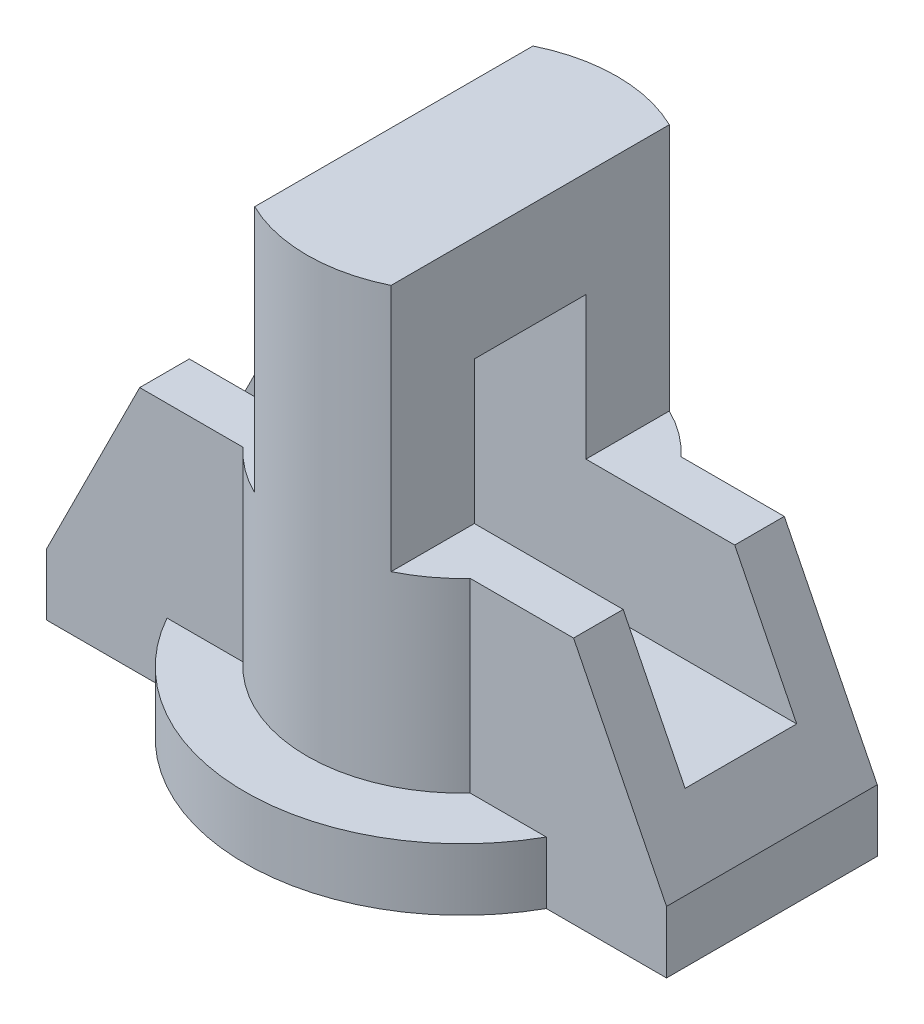
ISO-10303-21;
HEADER;
FILE_DESCRIPTION(('STEP AP214'),'2;1');
FILE_NAME('part.step','',(''),(''),'','','');
FILE_SCHEMA(('AUTOMOTIVE_DESIGN { 1 0 10303 214 1 1 1 1 }'));
ENDSEC;
DATA;
#1=APPLICATION_CONTEXT('core data for automotive mechanical design processes');
#2=APPLICATION_PROTOCOL_DEFINITION('international standard','automotive_design',2000,#1);
#3=PRODUCT_CONTEXT('',#1,'mechanical');
#4=PRODUCT('Part','Part','',(#3));
#5=PRODUCT_RELATED_PRODUCT_CATEGORY('part','',(#4));
#6=PRODUCT_DEFINITION_FORMATION('','',#4);
#7=PRODUCT_DEFINITION_CONTEXT('part definition',#1,'design');
#8=PRODUCT_DEFINITION('design','',#6,#7);
#9=PRODUCT_DEFINITION_SHAPE('','',#8);
#10=(LENGTH_UNIT() NAMED_UNIT(*) SI_UNIT(.MILLI.,.METRE.));
#11=(NAMED_UNIT(*) PLANE_ANGLE_UNIT() SI_UNIT($,.RADIAN.));
#12=(NAMED_UNIT(*) SI_UNIT($,.STERADIAN.) SOLID_ANGLE_UNIT());
#13=UNCERTAINTY_MEASURE_WITH_UNIT(LENGTH_MEASURE(1.E-05),#10,'distance_accuracy_value','');
#14=(GEOMETRIC_REPRESENTATION_CONTEXT(3) GLOBAL_UNCERTAINTY_ASSIGNED_CONTEXT((#13)) GLOBAL_UNIT_ASSIGNED_CONTEXT((#10,
#11,#12)) REPRESENTATION_CONTEXT('',''));
#15=CARTESIAN_POINT('',(0.,0.,0.));
#16=DIRECTION('',(0.,0.,1.));
#17=DIRECTION('',(1.,0.,0.));
#18=AXIS2_PLACEMENT_3D('',#15,#16,#17);
#19=CARTESIAN_POINT('',(0.,40.,0.));
#20=DIRECTION('',(0.,1.,0.));
#21=DIRECTION('',(0.,0.,1.));
#22=AXIS2_PLACEMENT_3D('',#19,#20,#21);
#23=PLANE('',#22);
#24=DIRECTION('',(-1.,0.,0.));
#25=VECTOR('',#24,1.);
#26=CARTESIAN_POINT('',(0.,40.,-9.00000000000001));
#27=LINE('',#26,#25);
#28=CARTESIAN_POINT('',(-11.,40.,-9.00000000000001));
#29=VERTEX_POINT('',#28);
#30=CARTESIAN_POINT('',(-34.9999999999993,40.,-9.00000000000001));
#31=VERTEX_POINT('',#30);
#32=EDGE_CURVE('E460',#29,#31,#27,.T.);
#33=ORIENTED_EDGE('',*,*,#32,.F.);
#34=DIRECTION('',(0.,0.,1.));
#35=VECTOR('',#34,1.);
#36=CARTESIAN_POINT('',(-11.,40.,0.));
#37=LINE('',#36,#35);
#38=CARTESIAN_POINT('',(-11.,40.,-22.4499443206437));
#39=VERTEX_POINT('',#38);
#40=EDGE_CURVE('E321',#39,#29,#37,.T.);
#41=ORIENTED_EDGE('',*,*,#40,.F.);
#42=CARTESIAN_POINT('',(0.,40.,0.));
#43=DIRECTION('',(0.,1.,0.));
#44=DIRECTION('',(0.,0.,1.));
#45=AXIS2_PLACEMENT_3D('',#42,#43,#44);
#46=CIRCLE('',#45,25.);
#47=CARTESIAN_POINT('',(-18.3303027798234,40.,-17.));
#48=VERTEX_POINT('',#47);
#49=EDGE_CURVE('E325',#39,#48,#46,.T.);
#50=ORIENTED_EDGE('',*,*,#49,.T.);
#51=DIRECTION('',(1.,0.,0.));
#52=VECTOR('',#51,1.);
#53=CARTESIAN_POINT('',(0.,40.,-17.));
#54=LINE('',#53,#52);
#55=CARTESIAN_POINT('',(-34.9999999999993,40.,-17.));
#56=VERTEX_POINT('',#55);
#57=EDGE_CURVE('E329',#56,#48,#54,.T.);
#58=ORIENTED_EDGE('',*,*,#57,.F.);
#59=DIRECTION('',(0.,0.,-1.));
#60=VECTOR('',#59,1.);
#61=CARTESIAN_POINT('',(-34.9999999999993,40.,0.));
#62=LINE('',#61,#60);
#63=EDGE_CURVE('E440',#31,#56,#62,.T.);
#64=ORIENTED_EDGE('',*,*,#63,.F.);
#65=EDGE_LOOP('',(#33,#41,#50,#58,#64));
#66=FACE_BOUND('',#65,.T.);
#67=ADVANCED_FACE('F45',(#66),#23,.T.);
#68=CARTESIAN_POINT('',(0.,40.,0.));
#69=DIRECTION('',(0.,1.,0.));
#70=DIRECTION('',(0.,0.,1.));
#71=AXIS2_PLACEMENT_3D('',#68,#69,#70);
#72=PLANE('',#71);
#73=DIRECTION('',(-1.,0.,0.));
#74=VECTOR('',#73,1.);
#75=CARTESIAN_POINT('',(0.,40.,-9.00000000000001));
#76=LINE('',#75,#74);
#77=CARTESIAN_POINT('',(35.0000000000007,40.,-9.00000000000001));
#78=VERTEX_POINT('',#77);
#79=CARTESIAN_POINT('',(11.,40.,-9.00000000000001));
#80=VERTEX_POINT('',#79);
#81=EDGE_CURVE('E246',#78,#80,#76,.T.);
#82=ORIENTED_EDGE('',*,*,#81,.F.);
#83=DIRECTION('',(0.,0.,1.));
#84=VECTOR('',#83,1.);
#85=CARTESIAN_POINT('',(35.0000000000007,40.,0.));
#86=LINE('',#85,#84);
#87=CARTESIAN_POINT('',(35.0000000000007,40.,-16.9999999999994));
#88=VERTEX_POINT('',#87);
#89=EDGE_CURVE('E437',#88,#78,#86,.T.);
#90=ORIENTED_EDGE('',*,*,#89,.F.);
#91=DIRECTION('',(1.,0.,0.));
#92=VECTOR('',#91,1.);
#93=CARTESIAN_POINT('',(-6.94156270925405E-13,40.,-16.999999999998));
#94=LINE('',#93,#92);
#95=CARTESIAN_POINT('',(18.3303027798246,40.,-16.9999999999987));
#96=VERTEX_POINT('',#95);
#97=EDGE_CURVE('E273',#96,#88,#94,.T.);
#98=ORIENTED_EDGE('',*,*,#97,.F.);
#99=CARTESIAN_POINT('',(0.,40.,0.));
#100=DIRECTION('',(0.,1.,0.));
#101=DIRECTION('',(0.,0.,1.));
#102=AXIS2_PLACEMENT_3D('',#99,#100,#101);
#103=CIRCLE('',#102,25.);
#104=CARTESIAN_POINT('',(11.,40.,-22.4499443206437));
#105=VERTEX_POINT('',#104);
#106=EDGE_CURVE('E278',#96,#105,#103,.T.);
#107=ORIENTED_EDGE('',*,*,#106,.T.);
#108=DIRECTION('',(0.,0.,1.));
#109=VECTOR('',#108,1.);
#110=CARTESIAN_POINT('',(11.,40.,0.));
#111=LINE('',#110,#109);
#112=EDGE_CURVE('E283',#105,#80,#111,.T.);
#113=ORIENTED_EDGE('',*,*,#112,.T.);
#114=EDGE_LOOP('',(#82,#90,#98,#107,#113));
#115=FACE_BOUND('',#114,.T.);
#116=ADVANCED_FACE('F503',(#115),#72,.T.);
#117=CARTESIAN_POINT('',(11.,80.,0.));
#118=DIRECTION('',(1.,0.,0.));
#119=DIRECTION('',(0.,0.,-1.));
#120=AXIS2_PLACEMENT_3D('',#117,#118,#119);
#121=PLANE('',#120);
#122=DIRECTION('',(0.,1.,0.));
#123=VECTOR('',#122,1.);
#124=CARTESIAN_POINT('',(11.,80.,-9.00000000000001));
#125=LINE('',#124,#123);
#126=CARTESIAN_POINT('',(11.,63.,-9.00000000000001));
#127=VERTEX_POINT('',#126);
#128=EDGE_CURVE('E240',#80,#127,#125,.T.);
#129=ORIENTED_EDGE('',*,*,#128,.F.);
#130=ORIENTED_EDGE('',*,*,#112,.F.);
#131=DIRECTION('',(0.,-1.,0.));
#132=VECTOR('',#131,1.);
#133=CARTESIAN_POINT('',(11.,80.,-22.4499443206437));
#134=LINE('',#133,#132);
#135=CARTESIAN_POINT('',(11.,80.,-22.4499443206437));
#136=VERTEX_POINT('',#135);
#137=EDGE_CURVE('E432',#136,#105,#134,.T.);
#138=ORIENTED_EDGE('',*,*,#137,.F.);
#139=DIRECTION('',(0.,0.,1.));
#140=VECTOR('',#139,1.);
#141=CARTESIAN_POINT('',(11.,80.,0.));
#142=LINE('',#141,#140);
#143=CARTESIAN_POINT('',(11.,80.,22.4499443206437));
#144=VERTEX_POINT('',#143);
#145=EDGE_CURVE('E408',#136,#144,#142,.T.);
#146=ORIENTED_EDGE('',*,*,#145,.T.);
#147=DIRECTION('',(0.,-1.,0.));
#148=VECTOR('',#147,1.);
#149=CARTESIAN_POINT('',(11.,80.,22.4499443206437));
#150=LINE('',#149,#148);
#151=CARTESIAN_POINT('',(11.,40.,22.4499443206437));
#152=VERTEX_POINT('',#151);
#153=EDGE_CURVE('E421',#144,#152,#150,.T.);
#154=ORIENTED_EDGE('',*,*,#153,.T.);
#155=CARTESIAN_POINT('',(11.,40.,9.));
#156=VERTEX_POINT('',#155);
#157=EDGE_CURVE('E282',#156,#152,#111,.T.);
#158=ORIENTED_EDGE('',*,*,#157,.F.);
#159=DIRECTION('',(0.,-1.,0.));
#160=VECTOR('',#159,1.);
#161=CARTESIAN_POINT('',(11.,80.,8.99999999999999));
#162=LINE('',#161,#160);
#163=CARTESIAN_POINT('',(11.,63.,8.99999999999999));
#164=VERTEX_POINT('',#163);
#165=EDGE_CURVE('E514',#164,#156,#162,.T.);
#166=ORIENTED_EDGE('',*,*,#165,.F.);
#167=DIRECTION('',(0.,0.,1.));
#168=VECTOR('',#167,1.);
#169=CARTESIAN_POINT('',(11.,63.,0.));
#170=LINE('',#169,#168);
#171=EDGE_CURVE('E239',#127,#164,#170,.T.);
#172=ORIENTED_EDGE('',*,*,#171,.F.);
#173=EDGE_LOOP('',(#129,#130,#138,#146,#154,#158,#166,#172));
#174=FACE_BOUND('',#173,.T.);
#175=ADVANCED_FACE('F47',(#174),#121,.T.);
#176=CARTESIAN_POINT('',(0.,80.,0.));
#177=DIRECTION('',(0.,-1.,0.));
#178=DIRECTION('',(0.,0.,-1.));
#179=AXIS2_PLACEMENT_3D('',#176,#177,#178);
#180=CYLINDRICAL_SURFACE('',#179,25.);
#181=ORIENTED_EDGE('',*,*,#137,.T.);
#182=ORIENTED_EDGE('',*,*,#106,.F.);
#183=DIRECTION('',(0.,-1.,0.));
#184=VECTOR('',#183,1.);
#185=CARTESIAN_POINT('',(18.3303027798246,40.,-16.9999999999987));
#186=LINE('',#185,#184);
#187=CARTESIAN_POINT('',(18.3303027798246,10.,-16.9999999999987));
#188=VERTEX_POINT('',#187);
#189=EDGE_CURVE('E304',#96,#188,#186,.T.);
#190=ORIENTED_EDGE('',*,*,#189,.T.);
#191=CARTESIAN_POINT('',(0.,10.,0.));
#192=DIRECTION('',(0.,1.,0.));
#193=DIRECTION('',(0.,0.,1.));
#194=AXIS2_PLACEMENT_3D('',#191,#192,#193);
#195=CIRCLE('',#194,25.);
#196=CARTESIAN_POINT('',(-18.3303027798234,10.,-17.));
#197=VERTEX_POINT('',#196);
#198=EDGE_CURVE('E395',#188,#197,#195,.T.);
#199=ORIENTED_EDGE('',*,*,#198,.T.);
#200=DIRECTION('',(0.,-1.,0.));
#201=VECTOR('',#200,1.);
#202=CARTESIAN_POINT('',(-18.3303027798234,40.,-17.));
#203=LINE('',#202,#201);
#204=EDGE_CURVE('E355',#48,#197,#203,.T.);
#205=ORIENTED_EDGE('',*,*,#204,.F.);
#206=ORIENTED_EDGE('',*,*,#49,.F.);
#207=DIRECTION('',(0.,-1.,0.));
#208=VECTOR('',#207,1.);
#209=CARTESIAN_POINT('',(-11.,80.,-22.4499443206437));
#210=LINE('',#209,#208);
#211=CARTESIAN_POINT('',(-11.,80.,-22.4499443206437));
#212=VERTEX_POINT('',#211);
#213=EDGE_CURVE('E429',#212,#39,#210,.T.);
#214=ORIENTED_EDGE('',*,*,#213,.F.);
#215=CARTESIAN_POINT('',(0.,80.,0.));
#216=DIRECTION('',(0.,1.,0.));
#217=DIRECTION('',(0.,0.,1.));
#218=AXIS2_PLACEMENT_3D('',#215,#216,#217);
#219=CIRCLE('',#218,25.);
#220=EDGE_CURVE('E412',#136,#212,#219,.T.);
#221=ORIENTED_EDGE('',*,*,#220,.F.);
#222=EDGE_LOOP('',(#181,#182,#190,#199,#205,#206,#214,#221));
#223=FACE_BOUND('',#222,.T.);
#224=ADVANCED_FACE('F614',(#223),#180,.T.);
#225=CARTESIAN_POINT('',(-11.,80.,0.));
#226=DIRECTION('',(1.,0.,0.));
#227=DIRECTION('',(0.,0.,-1.));
#228=AXIS2_PLACEMENT_3D('',#225,#226,#227);
#229=PLANE('',#228);
#230=ORIENTED_EDGE('',*,*,#40,.T.);
#231=DIRECTION('',(0.,1.,0.));
#232=VECTOR('',#231,1.);
#233=CARTESIAN_POINT('',(-11.,80.,-9.00000000000001));
#234=LINE('',#233,#232);
#235=CARTESIAN_POINT('',(-11.,63.,-9.00000000000001));
#236=VERTEX_POINT('',#235);
#237=EDGE_CURVE('E506',#29,#236,#234,.T.);
#238=ORIENTED_EDGE('',*,*,#237,.T.);
#239=DIRECTION('',(0.,0.,1.));
#240=VECTOR('',#239,1.);
#241=CARTESIAN_POINT('',(-11.,63.,0.));
#242=LINE('',#241,#240);
#243=CARTESIAN_POINT('',(-11.,63.,8.99999999999999));
#244=VERTEX_POINT('',#243);
#245=EDGE_CURVE('E11',#236,#244,#242,.T.);
#246=ORIENTED_EDGE('',*,*,#245,.T.);
#247=DIRECTION('',(0.,-1.,0.));
#248=VECTOR('',#247,1.);
#249=CARTESIAN_POINT('',(-11.,80.,8.99999999999999));
#250=LINE('',#249,#248);
#251=CARTESIAN_POINT('',(-11.,40.,9.));
#252=VERTEX_POINT('',#251);
#253=EDGE_CURVE('E221',#244,#252,#250,.T.);
#254=ORIENTED_EDGE('',*,*,#253,.T.);
#255=CARTESIAN_POINT('',(-11.,40.,22.4499443206437));
#256=VERTEX_POINT('',#255);
#257=EDGE_CURVE('E319',#252,#256,#37,.T.);
#258=ORIENTED_EDGE('',*,*,#257,.T.);
#259=DIRECTION('',(0.,-1.,0.));
#260=VECTOR('',#259,1.);
#261=CARTESIAN_POINT('',(-11.,80.,22.4499443206437));
#262=LINE('',#261,#260);
#263=CARTESIAN_POINT('',(-11.,80.,22.4499443206437));
#264=VERTEX_POINT('',#263);
#265=EDGE_CURVE('E425',#264,#256,#262,.T.);
#266=ORIENTED_EDGE('',*,*,#265,.F.);
#267=DIRECTION('',(0.,0.,1.));
#268=VECTOR('',#267,1.);
#269=CARTESIAN_POINT('',(-11.,80.,0.));
#270=LINE('',#269,#268);
#271=EDGE_CURVE('E415',#212,#264,#270,.T.);
#272=ORIENTED_EDGE('',*,*,#271,.F.);
#273=ORIENTED_EDGE('',*,*,#213,.T.);
#274=EDGE_LOOP('',(#230,#238,#246,#254,#258,#266,#272,#273));
#275=FACE_BOUND('',#274,.T.);
#276=ADVANCED_FACE('F612',(#275),#229,.F.);
#277=CARTESIAN_POINT('',(0.,80.,0.));
#278=DIRECTION('',(0.,-1.,0.));
#279=DIRECTION('',(0.,0.,-1.));
#280=AXIS2_PLACEMENT_3D('',#277,#278,#279);
#281=CYLINDRICAL_SURFACE('',#280,25.);
#282=ORIENTED_EDGE('',*,*,#265,.T.);
#283=CARTESIAN_POINT('',(0.,40.,0.));
#284=DIRECTION('',(0.,1.,0.));
#285=DIRECTION('',(0.,0.,1.));
#286=AXIS2_PLACEMENT_3D('',#283,#284,#285);
#287=CIRCLE('',#286,25.);
#288=CARTESIAN_POINT('',(-18.3303027798246,40.,16.9999999999987));
#289=VERTEX_POINT('',#288);
#290=EDGE_CURVE('E315',#289,#256,#287,.T.);
#291=ORIENTED_EDGE('',*,*,#290,.F.);
#292=DIRECTION('',(0.,-1.,0.));
#293=VECTOR('',#292,1.);
#294=CARTESIAN_POINT('',(-18.3303027798246,40.,16.9999999999987));
#295=LINE('',#294,#293);
#296=CARTESIAN_POINT('',(-18.3303027798246,10.,16.9999999999987));
#297=VERTEX_POINT('',#296);
#298=EDGE_CURVE('E335',#289,#297,#295,.T.);
#299=ORIENTED_EDGE('',*,*,#298,.T.);
#300=CARTESIAN_POINT('',(0.,10.,0.));
#301=DIRECTION('',(0.,1.,0.));
#302=DIRECTION('',(0.,0.,1.));
#303=AXIS2_PLACEMENT_3D('',#300,#301,#302);
#304=CIRCLE('',#303,25.);
#305=CARTESIAN_POINT('',(18.3303027798234,10.,17.));
#306=VERTEX_POINT('',#305);
#307=EDGE_CURVE('E371',#297,#306,#304,.T.);
#308=ORIENTED_EDGE('',*,*,#307,.T.);
#309=DIRECTION('',(0.,-1.,0.));
#310=VECTOR('',#309,1.);
#311=CARTESIAN_POINT('',(18.3303027798234,40.,17.));
#312=LINE('',#311,#310);
#313=CARTESIAN_POINT('',(18.3303027798234,40.,17.));
#314=VERTEX_POINT('',#313);
#315=EDGE_CURVE('E290',#314,#306,#312,.T.);
#316=ORIENTED_EDGE('',*,*,#315,.F.);
#317=CARTESIAN_POINT('',(0.,40.,0.));
#318=DIRECTION('',(0.,1.,0.));
#319=DIRECTION('',(0.,0.,1.));
#320=AXIS2_PLACEMENT_3D('',#317,#318,#319);
#321=CIRCLE('',#320,25.);
#322=EDGE_CURVE('E287',#152,#314,#321,.T.);
#323=ORIENTED_EDGE('',*,*,#322,.F.);
#324=ORIENTED_EDGE('',*,*,#153,.F.);
#325=CARTESIAN_POINT('',(0.,80.,0.));
#326=DIRECTION('',(0.,1.,0.));
#327=DIRECTION('',(0.,0.,1.));
#328=AXIS2_PLACEMENT_3D('',#325,#326,#327);
#329=CIRCLE('',#328,25.);
#330=EDGE_CURVE('E418',#264,#144,#329,.T.);
#331=ORIENTED_EDGE('',*,*,#330,.F.);
#332=EDGE_LOOP('',(#282,#291,#299,#308,#316,#323,#324,#331));
#333=FACE_BOUND('',#332,.T.);
#334=ADVANCED_FACE('F477',(#333),#281,.T.);
#335=CARTESIAN_POINT('',(0.,80.,0.));
#336=DIRECTION('',(0.,1.,0.));
#337=DIRECTION('',(0.,0.,1.));
#338=AXIS2_PLACEMENT_3D('',#335,#336,#337);
#339=PLANE('',#338);
#340=ORIENTED_EDGE('',*,*,#145,.F.);
#341=ORIENTED_EDGE('',*,*,#220,.T.);
#342=ORIENTED_EDGE('',*,*,#271,.T.);
#343=ORIENTED_EDGE('',*,*,#330,.T.);
#344=EDGE_LOOP('',(#340,#341,#342,#343));
#345=FACE_BOUND('',#344,.T.);
#346=ADVANCED_FACE('F604',(#345),#339,.T.);
#347=CARTESIAN_POINT('',(0.,0.,0.));
#348=DIRECTION('',(0.,1.,0.));
#349=DIRECTION('',(0.,0.,1.));
#350=AXIS2_PLACEMENT_3D('',#347,#348,#349);
#351=PLANE('',#350);
#352=CARTESIAN_POINT('',(0.,0.,0.));
#353=DIRECTION('',(0.,1.,0.));
#354=DIRECTION('',(0.,0.,1.));
#355=AXIS2_PLACEMENT_3D('',#352,#353,#354);
#356=CIRCLE('',#355,35.);
#357=CARTESIAN_POINT('',(30.5941170815572,0.,-16.9999999999992));
#358=VERTEX_POINT('',#357);
#359=CARTESIAN_POINT('',(-30.5941170815567,0.,-17.));
#360=VERTEX_POINT('',#359);
#361=EDGE_CURVE('E383',#358,#360,#356,.T.);
#362=ORIENTED_EDGE('',*,*,#361,.F.);
#363=DIRECTION('',(1.,0.,0.));
#364=VECTOR('',#363,1.);
#365=CARTESIAN_POINT('',(-6.94156270925405E-13,0.,-16.999999999998));
#366=LINE('',#365,#364);
#367=CARTESIAN_POINT('',(50.,0.,-17.));
#368=VERTEX_POINT('',#367);
#369=EDGE_CURVE('E274',#358,#368,#366,.T.);
#370=ORIENTED_EDGE('',*,*,#369,.T.);
#371=DIRECTION('',(0.,0.,-1.));
#372=VECTOR('',#371,1.);
#373=CARTESIAN_POINT('',(50.,0.,0.));
#374=LINE('',#373,#372);
#375=CARTESIAN_POINT('',(50.,0.,17.));
#376=VERTEX_POINT('',#375);
#377=EDGE_CURVE('E294',#376,#368,#374,.T.);
#378=ORIENTED_EDGE('',*,*,#377,.F.);
#379=DIRECTION('',(1.,0.,0.));
#380=VECTOR('',#379,1.);
#381=CARTESIAN_POINT('',(0.,0.,17.));
#382=LINE('',#381,#380);
#383=CARTESIAN_POINT('',(30.5941170815567,0.,17.));
#384=VERTEX_POINT('',#383);
#385=EDGE_CURVE('E268',#384,#376,#382,.T.);
#386=ORIENTED_EDGE('',*,*,#385,.F.);
#387=CARTESIAN_POINT('',(0.,0.,0.));
#388=DIRECTION('',(0.,1.,0.));
#389=DIRECTION('',(0.,0.,1.));
#390=AXIS2_PLACEMENT_3D('',#387,#388,#389);
#391=CIRCLE('',#390,35.);
#392=CARTESIAN_POINT('',(-30.5941170815571,0.,16.9999999999992));
#393=VERTEX_POINT('',#392);
#394=EDGE_CURVE('E359',#393,#384,#391,.T.);
#395=ORIENTED_EDGE('',*,*,#394,.F.);
#396=DIRECTION('',(1.,0.,0.));
#397=VECTOR('',#396,1.);
#398=CARTESIAN_POINT('',(6.98693240016421E-13,0.,16.999999999998));
#399=LINE('',#398,#397);
#400=CARTESIAN_POINT('',(-50.,0.,17.));
#401=VERTEX_POINT('',#400);
#402=EDGE_CURVE('E320',#401,#393,#399,.T.);
#403=ORIENTED_EDGE('',*,*,#402,.F.);
#404=DIRECTION('',(0.,0.,1.));
#405=VECTOR('',#404,1.);
#406=CARTESIAN_POINT('',(-50.,0.,0.));
#407=LINE('',#406,#405);
#408=CARTESIAN_POINT('',(-50.,0.,-17.));
#409=VERTEX_POINT('',#408);
#410=EDGE_CURVE('E339',#409,#401,#407,.T.);
#411=ORIENTED_EDGE('',*,*,#410,.F.);
#412=DIRECTION('',(1.,0.,0.));
#413=VECTOR('',#412,1.);
#414=CARTESIAN_POINT('',(0.,0.,-17.));
#415=LINE('',#414,#413);
#416=EDGE_CURVE('E314',#409,#360,#415,.T.);
#417=ORIENTED_EDGE('',*,*,#416,.T.);
#418=EDGE_LOOP('',(#362,#370,#378,#386,#395,#403,#411,#417));
#419=FACE_BOUND('',#418,.T.);
#420=ADVANCED_FACE('F493',(#419),#351,.F.);
#421=CARTESIAN_POINT('',(0.,10.,0.));
#422=DIRECTION('',(0.,-1.,0.));
#423=DIRECTION('',(0.,0.,-1.));
#424=AXIS2_PLACEMENT_3D('',#421,#422,#423);
#425=CYLINDRICAL_SURFACE('',#424,35.);
#426=ORIENTED_EDGE('',*,*,#361,.T.);
#427=DIRECTION('',(0.,-1.,0.));
#428=VECTOR('',#427,1.);
#429=CARTESIAN_POINT('',(-30.5941170815567,10.,-17.));
#430=LINE('',#429,#428);
#431=CARTESIAN_POINT('',(-30.5941170815567,10.,-17.));
#432=VERTEX_POINT('',#431);
#433=EDGE_CURVE('E398',#432,#360,#430,.T.);
#434=ORIENTED_EDGE('',*,*,#433,.F.);
#435=CARTESIAN_POINT('',(0.,10.,0.));
#436=DIRECTION('',(0.,1.,0.));
#437=DIRECTION('',(0.,0.,1.));
#438=AXIS2_PLACEMENT_3D('',#435,#436,#437);
#439=CIRCLE('',#438,35.);
#440=CARTESIAN_POINT('',(30.5941170815572,10.,-16.9999999999992));
#441=VERTEX_POINT('',#440);
#442=EDGE_CURVE('E388',#441,#432,#439,.T.);
#443=ORIENTED_EDGE('',*,*,#442,.F.);
#444=DIRECTION('',(0.,-1.,0.));
#445=VECTOR('',#444,1.);
#446=CARTESIAN_POINT('',(30.5941170815572,10.,-16.9999999999992));
#447=LINE('',#446,#445);
#448=EDGE_CURVE('E404',#441,#358,#447,.T.);
#449=ORIENTED_EDGE('',*,*,#448,.T.);
#450=EDGE_LOOP('',(#426,#434,#443,#449));
#451=FACE_BOUND('',#450,.T.);
#452=ADVANCED_FACE('F599',(#451),#425,.T.);
#453=CARTESIAN_POINT('',(0.,10.,0.));
#454=DIRECTION('',(0.,1.,0.));
#455=DIRECTION('',(0.,0.,1.));
#456=AXIS2_PLACEMENT_3D('',#453,#454,#455);
#457=PLANE('',#456);
#458=DIRECTION('',(1.,0.,0.));
#459=VECTOR('',#458,1.);
#460=CARTESIAN_POINT('',(-6.94156270925405E-13,10.,-16.999999999998));
#461=LINE('',#460,#459);
#462=EDGE_CURVE('E384',#188,#441,#461,.T.);
#463=ORIENTED_EDGE('',*,*,#462,.T.);
#464=ORIENTED_EDGE('',*,*,#442,.T.);
#465=DIRECTION('',(1.,0.,0.));
#466=VECTOR('',#465,1.);
#467=CARTESIAN_POINT('',(0.,10.,-17.));
#468=LINE('',#467,#466);
#469=EDGE_CURVE('E391',#432,#197,#468,.T.);
#470=ORIENTED_EDGE('',*,*,#469,.T.);
#471=ORIENTED_EDGE('',*,*,#198,.F.);
#472=EDGE_LOOP('',(#463,#464,#470,#471));
#473=FACE_BOUND('',#472,.T.);
#474=ADVANCED_FACE('F594',(#473),#457,.T.);
#475=CARTESIAN_POINT('',(0.,10.,0.));
#476=DIRECTION('',(0.,-1.,0.));
#477=DIRECTION('',(0.,0.,-1.));
#478=AXIS2_PLACEMENT_3D('',#475,#476,#477);
#479=CYLINDRICAL_SURFACE('',#478,35.);
#480=ORIENTED_EDGE('',*,*,#394,.T.);
#481=DIRECTION('',(0.,-1.,0.));
#482=VECTOR('',#481,1.);
#483=CARTESIAN_POINT('',(30.5941170815567,10.,17.));
#484=LINE('',#483,#482);
#485=CARTESIAN_POINT('',(30.5941170815567,10.,17.));
#486=VERTEX_POINT('',#485);
#487=EDGE_CURVE('E374',#486,#384,#484,.T.);
#488=ORIENTED_EDGE('',*,*,#487,.F.);
#489=CARTESIAN_POINT('',(0.,10.,0.));
#490=DIRECTION('',(0.,1.,0.));
#491=DIRECTION('',(0.,0.,1.));
#492=AXIS2_PLACEMENT_3D('',#489,#490,#491);
#493=CIRCLE('',#492,35.);
#494=CARTESIAN_POINT('',(-30.5941170815571,10.,16.9999999999992));
#495=VERTEX_POINT('',#494);
#496=EDGE_CURVE('E364',#495,#486,#493,.T.);
#497=ORIENTED_EDGE('',*,*,#496,.F.);
#498=DIRECTION('',(0.,-1.,0.));
#499=VECTOR('',#498,1.);
#500=CARTESIAN_POINT('',(-30.5941170815571,10.,16.9999999999992));
#501=LINE('',#500,#499);
#502=EDGE_CURVE('E380',#495,#393,#501,.T.);
#503=ORIENTED_EDGE('',*,*,#502,.T.);
#504=EDGE_LOOP('',(#480,#488,#497,#503));
#505=FACE_BOUND('',#504,.T.);
#506=ADVANCED_FACE('F582',(#505),#479,.T.);
#507=CARTESIAN_POINT('',(0.,10.,0.));
#508=DIRECTION('',(0.,1.,0.));
#509=DIRECTION('',(0.,0.,1.));
#510=AXIS2_PLACEMENT_3D('',#507,#508,#509);
#511=PLANE('',#510);
#512=DIRECTION('',(1.,0.,0.));
#513=VECTOR('',#512,1.);
#514=CARTESIAN_POINT('',(6.98693240016421E-13,10.,16.999999999998));
#515=LINE('',#514,#513);
#516=EDGE_CURVE('E360',#495,#297,#515,.T.);
#517=ORIENTED_EDGE('',*,*,#516,.F.);
#518=ORIENTED_EDGE('',*,*,#496,.T.);
#519=DIRECTION('',(1.,0.,0.));
#520=VECTOR('',#519,1.);
#521=CARTESIAN_POINT('',(0.,10.,17.));
#522=LINE('',#521,#520);
#523=EDGE_CURVE('E367',#306,#486,#522,.T.);
#524=ORIENTED_EDGE('',*,*,#523,.F.);
#525=ORIENTED_EDGE('',*,*,#307,.F.);
#526=EDGE_LOOP('',(#517,#518,#524,#525));
#527=FACE_BOUND('',#526,.T.);
#528=ADVANCED_FACE('F584',(#527),#511,.T.);
#529=CARTESIAN_POINT('',(0.,40.,-17.));
#530=DIRECTION('',(0.,0.,-1.));
#531=DIRECTION('',(-1.,0.,0.));
#532=AXIS2_PLACEMENT_3D('',#529,#530,#531);
#533=PLANE('',#532);
#534=DIRECTION('',(-0.447213595499974,-0.894427190999908,0.));
#535=VECTOR('',#534,1.);
#536=CARTESIAN_POINT('',(-27.9999999999989,54.0000000000001,-17.));
#537=LINE('',#536,#535);
#538=CARTESIAN_POINT('',(-50.,10.,-17.));
#539=VERTEX_POINT('',#538);
#540=EDGE_CURVE('E265',#56,#539,#537,.T.);
#541=ORIENTED_EDGE('',*,*,#540,.F.);
#542=ORIENTED_EDGE('',*,*,#57,.T.);
#543=ORIENTED_EDGE('',*,*,#204,.T.);
#544=ORIENTED_EDGE('',*,*,#469,.F.);
#545=ORIENTED_EDGE('',*,*,#433,.T.);
#546=ORIENTED_EDGE('',*,*,#416,.F.);
#547=DIRECTION('',(0.,-1.,0.));
#548=VECTOR('',#547,1.);
#549=CARTESIAN_POINT('',(-50.,40.,-17.));
#550=LINE('',#549,#548);
#551=EDGE_CURVE('E352',#539,#409,#550,.T.);
#552=ORIENTED_EDGE('',*,*,#551,.F.);
#553=EDGE_LOOP('',(#541,#542,#543,#544,#545,#546,#552));
#554=FACE_BOUND('',#553,.T.);
#555=ADVANCED_FACE('F586',(#554),#533,.T.);
#556=CARTESIAN_POINT('',(6.98693240016421E-13,40.,16.999999999998));
#557=DIRECTION('',(0.,0.,-1.));
#558=DIRECTION('',(-1.,0.,0.));
#559=AXIS2_PLACEMENT_3D('',#556,#557,#558);
#560=PLANE('',#559);
#561=DIRECTION('',(1.,0.,0.));
#562=VECTOR('',#561,1.);
#563=CARTESIAN_POINT('',(6.98693240016421E-13,40.,16.999999999998));
#564=LINE('',#563,#562);
#565=CARTESIAN_POINT('',(-34.9999999999993,40.,16.9999999999994));
#566=VERTEX_POINT('',#565);
#567=EDGE_CURVE('E332',#566,#289,#564,.T.);
#568=ORIENTED_EDGE('',*,*,#567,.F.);
#569=DIRECTION('',(0.447213595499974,0.894427190999908,0.));
#570=VECTOR('',#569,1.);
#571=CARTESIAN_POINT('',(-50.,10.,16.999999999998));
#572=LINE('',#571,#570);
#573=CARTESIAN_POINT('',(-50.,10.,16.999999999998));
#574=VERTEX_POINT('',#573);
#575=EDGE_CURVE('E250',#574,#566,#572,.T.);
#576=ORIENTED_EDGE('',*,*,#575,.F.);
#577=DIRECTION('',(0.,-1.,0.));
#578=VECTOR('',#577,1.);
#579=CARTESIAN_POINT('',(-50.,40.,17.));
#580=LINE('',#579,#578);
#581=EDGE_CURVE('E349',#574,#401,#580,.T.);
#582=ORIENTED_EDGE('',*,*,#581,.T.);
#583=ORIENTED_EDGE('',*,*,#402,.T.);
#584=ORIENTED_EDGE('',*,*,#502,.F.);
#585=ORIENTED_EDGE('',*,*,#516,.T.);
#586=ORIENTED_EDGE('',*,*,#298,.F.);
#587=EDGE_LOOP('',(#568,#576,#582,#583,#584,#585,#586));
#588=FACE_BOUND('',#587,.T.);
#589=ADVANCED_FACE('F563',(#588),#560,.F.);
#590=CARTESIAN_POINT('',(-50.,40.,0.));
#591=DIRECTION('',(1.,0.,0.));
#592=DIRECTION('',(0.,0.,-1.));
#593=AXIS2_PLACEMENT_3D('',#590,#591,#592);
#594=PLANE('',#593);
#595=ORIENTED_EDGE('',*,*,#581,.F.);
#596=DIRECTION('',(0.,0.,1.));
#597=VECTOR('',#596,1.);
#598=CARTESIAN_POINT('',(-50.,10.,-35.));
#599=LINE('',#598,#597);
#600=EDGE_CURVE('E253',#539,#574,#599,.T.);
#601=ORIENTED_EDGE('',*,*,#600,.F.);
#602=ORIENTED_EDGE('',*,*,#551,.T.);
#603=ORIENTED_EDGE('',*,*,#410,.T.);
#604=EDGE_LOOP('',(#595,#601,#602,#603));
#605=FACE_BOUND('',#604,.T.);
#606=ADVANCED_FACE('F556',(#605),#594,.F.);
#607=DIRECTION('',(1.,0.,0.));
#608=VECTOR('',#607,1.);
#609=CARTESIAN_POINT('',(0.,40.,9.));
#610=LINE('',#609,#608);
#611=CARTESIAN_POINT('',(-34.9999999999993,40.,9.));
#612=VERTEX_POINT('',#611);
#613=EDGE_CURVE('E522',#612,#252,#610,.T.);
#614=ORIENTED_EDGE('',*,*,#613,.F.);
#615=EDGE_CURVE('E441',#566,#612,#62,.T.);
#616=ORIENTED_EDGE('',*,*,#615,.F.);
#617=ORIENTED_EDGE('',*,*,#567,.T.);
#618=ORIENTED_EDGE('',*,*,#290,.T.);
#619=ORIENTED_EDGE('',*,*,#257,.F.);
#620=EDGE_LOOP('',(#614,#616,#617,#618,#619));
#621=FACE_BOUND('',#620,.T.);
#622=ADVANCED_FACE('F548',(#621),#23,.T.);
#623=CARTESIAN_POINT('',(-6.94156270925405E-13,40.,-16.999999999998));
#624=DIRECTION('',(0.,0.,-1.));
#625=DIRECTION('',(-1.,0.,0.));
#626=AXIS2_PLACEMENT_3D('',#623,#624,#625);
#627=PLANE('',#626);
#628=DIRECTION('',(-0.447213595499975,0.894427190999908,0.));
#629=VECTOR('',#628,1.);
#630=CARTESIAN_POINT('',(27.9999999999999,54.000000000001,-16.9999999999991));
#631=LINE('',#630,#629);
#632=CARTESIAN_POINT('',(50.0000000000014,10.,-17.));
#633=VERTEX_POINT('',#632);
#634=EDGE_CURVE('E257',#633,#88,#631,.T.);
#635=ORIENTED_EDGE('',*,*,#634,.F.);
#636=DIRECTION('',(0.,-1.,0.));
#637=VECTOR('',#636,1.);
#638=CARTESIAN_POINT('',(50.,40.,-17.));
#639=LINE('',#638,#637);
#640=EDGE_CURVE('E308',#633,#368,#639,.T.);
#641=ORIENTED_EDGE('',*,*,#640,.T.);
#642=ORIENTED_EDGE('',*,*,#369,.F.);
#643=ORIENTED_EDGE('',*,*,#448,.F.);
#644=ORIENTED_EDGE('',*,*,#462,.F.);
#645=ORIENTED_EDGE('',*,*,#189,.F.);
#646=ORIENTED_EDGE('',*,*,#97,.T.);
#647=EDGE_LOOP('',(#635,#641,#642,#643,#644,#645,#646));
#648=FACE_BOUND('',#647,.T.);
#649=ADVANCED_FACE('F497',(#648),#627,.T.);
#650=CARTESIAN_POINT('',(0.,40.,17.));
#651=DIRECTION('',(0.,0.,-1.));
#652=DIRECTION('',(-1.,0.,0.));
#653=AXIS2_PLACEMENT_3D('',#650,#651,#652);
#654=PLANE('',#653);
#655=DIRECTION('',(0.,-1.,0.));
#656=VECTOR('',#655,1.);
#657=CARTESIAN_POINT('',(50.,40.,17.));
#658=LINE('',#657,#656);
#659=CARTESIAN_POINT('',(50.0000000000014,10.,16.999999999998));
#660=VERTEX_POINT('',#659);
#661=EDGE_CURVE('E311',#660,#376,#658,.T.);
#662=ORIENTED_EDGE('',*,*,#661,.F.);
#663=DIRECTION('',(0.447213595499975,-0.894427190999908,0.));
#664=VECTOR('',#663,1.);
#665=CARTESIAN_POINT('',(50.0000000000014,10.,16.999999999998));
#666=LINE('',#665,#664);
#667=CARTESIAN_POINT('',(35.0000000000007,40.,16.999999999998));
#668=VERTEX_POINT('',#667);
#669=EDGE_CURVE('E254',#668,#660,#666,.T.);
#670=ORIENTED_EDGE('',*,*,#669,.F.);
#671=DIRECTION('',(1.,0.,0.));
#672=VECTOR('',#671,1.);
#673=CARTESIAN_POINT('',(0.,40.,17.));
#674=LINE('',#673,#672);
#675=EDGE_CURVE('E269',#314,#668,#674,.T.);
#676=ORIENTED_EDGE('',*,*,#675,.F.);
#677=ORIENTED_EDGE('',*,*,#315,.T.);
#678=ORIENTED_EDGE('',*,*,#523,.T.);
#679=ORIENTED_EDGE('',*,*,#487,.T.);
#680=ORIENTED_EDGE('',*,*,#385,.T.);
#681=EDGE_LOOP('',(#662,#670,#676,#677,#678,#679,#680));
#682=FACE_BOUND('',#681,.T.);
#683=ADVANCED_FACE('F483',(#682),#654,.F.);
#684=CARTESIAN_POINT('',(50.,40.,0.));
#685=DIRECTION('',(-1.,0.,0.));
#686=DIRECTION('',(0.,0.,1.));
#687=AXIS2_PLACEMENT_3D('',#684,#685,#686);
#688=PLANE('',#687);
#689=ORIENTED_EDGE('',*,*,#640,.F.);
#690=DIRECTION('',(0.,0.,1.));
#691=VECTOR('',#690,1.);
#692=CARTESIAN_POINT('',(50.0000000000014,10.,-35.));
#693=LINE('',#692,#691);
#694=EDGE_CURVE('E244',#633,#660,#693,.T.);
#695=ORIENTED_EDGE('',*,*,#694,.T.);
#696=ORIENTED_EDGE('',*,*,#661,.T.);
#697=ORIENTED_EDGE('',*,*,#377,.T.);
#698=EDGE_LOOP('',(#689,#695,#696,#697));
#699=FACE_BOUND('',#698,.T.);
#700=ADVANCED_FACE('F487',(#699),#688,.F.);
#701=DIRECTION('',(1.,0.,0.));
#702=VECTOR('',#701,1.);
#703=CARTESIAN_POINT('',(0.,40.,9.));
#704=LINE('',#703,#702);
#705=CARTESIAN_POINT('',(35.0000000000007,40.,9.00000000000001));
#706=VERTEX_POINT('',#705);
#707=EDGE_CURVE('E61',#156,#706,#704,.T.);
#708=ORIENTED_EDGE('',*,*,#707,.F.);
#709=ORIENTED_EDGE('',*,*,#157,.T.);
#710=ORIENTED_EDGE('',*,*,#322,.T.);
#711=ORIENTED_EDGE('',*,*,#675,.T.);
#712=EDGE_CURVE('E436',#706,#668,#86,.T.);
#713=ORIENTED_EDGE('',*,*,#712,.F.);
#714=EDGE_LOOP('',(#708,#709,#710,#711,#713));
#715=FACE_BOUND('',#714,.T.);
#716=ADVANCED_FACE('F467',(#715),#72,.T.);
#717=CARTESIAN_POINT('',(50.0000000000014,10.,-35.));
#718=DIRECTION('',(-0.894427190999908,-0.447213595499975,0.));
#719=DIRECTION('',(0.447213595499975,-0.894427190999908,0.));
#720=AXIS2_PLACEMENT_3D('',#717,#718,#719);
#721=PLANE('',#720);
#722=ORIENTED_EDGE('',*,*,#89,.T.);
#723=DIRECTION('',(0.447213595499975,-0.894427190999908,0.));
#724=VECTOR('',#723,1.);
#725=CARTESIAN_POINT('',(50.0000000000014,10.,-9.00000000000001));
#726=LINE('',#725,#724);
#727=CARTESIAN_POINT('',(45.0000000000012,20.,-9.00000000000001));
#728=VERTEX_POINT('',#727);
#729=EDGE_CURVE('E237',#78,#728,#726,.T.);
#730=ORIENTED_EDGE('',*,*,#729,.T.);
#731=DIRECTION('',(0.,0.,1.));
#732=VECTOR('',#731,1.);
#733=CARTESIAN_POINT('',(45.0000000000012,20.,-35.));
#734=LINE('',#733,#732);
#735=CARTESIAN_POINT('',(45.0000000000012,20.,9.00000000000001));
#736=VERTEX_POINT('',#735);
#737=EDGE_CURVE('E226',#728,#736,#734,.T.);
#738=ORIENTED_EDGE('',*,*,#737,.T.);
#739=DIRECTION('',(-0.447213595499975,0.894427190999908,0.));
#740=VECTOR('',#739,1.);
#741=CARTESIAN_POINT('',(50.0000000000014,10.,9.00000000000001));
#742=LINE('',#741,#740);
#743=EDGE_CURVE('E215',#736,#706,#742,.T.);
#744=ORIENTED_EDGE('',*,*,#743,.T.);
#745=ORIENTED_EDGE('',*,*,#712,.T.);
#746=ORIENTED_EDGE('',*,*,#669,.T.);
#747=ORIENTED_EDGE('',*,*,#694,.F.);
#748=ORIENTED_EDGE('',*,*,#634,.T.);
#749=EDGE_LOOP('',(#722,#730,#738,#744,#745,#746,#747,#748));
#750=FACE_BOUND('',#749,.T.);
#751=ADVANCED_FACE('F236',(#750),#721,.F.);
#752=CARTESIAN_POINT('',(-50.,10.,-35.));
#753=DIRECTION('',(0.894427190999908,-0.447213595499974,0.));
#754=DIRECTION('',(0.447213595499974,0.894427190999908,0.));
#755=AXIS2_PLACEMENT_3D('',#752,#753,#754);
#756=PLANE('',#755);
#757=DIRECTION('',(0.,0.,-1.));
#758=VECTOR('',#757,1.);
#759=CARTESIAN_POINT('',(-44.9999999999998,20.,-35.));
#760=LINE('',#759,#758);
#761=CARTESIAN_POINT('',(-44.9999999999998,20.,9.00000000000001));
#762=VERTEX_POINT('',#761);
#763=CARTESIAN_POINT('',(-44.9999999999997,20.,-9.00000000000001));
#764=VERTEX_POINT('',#763);
#765=EDGE_CURVE('E229',#762,#764,#760,.T.);
#766=ORIENTED_EDGE('',*,*,#765,.T.);
#767=DIRECTION('',(0.447213595499974,0.894427190999908,0.));
#768=VECTOR('',#767,1.);
#769=CARTESIAN_POINT('',(-50.,10.,-9.00000000000001));
#770=LINE('',#769,#768);
#771=EDGE_CURVE('E54',#764,#31,#770,.T.);
#772=ORIENTED_EDGE('',*,*,#771,.T.);
#773=ORIENTED_EDGE('',*,*,#63,.T.);
#774=ORIENTED_EDGE('',*,*,#540,.T.);
#775=ORIENTED_EDGE('',*,*,#600,.T.);
#776=ORIENTED_EDGE('',*,*,#575,.T.);
#777=ORIENTED_EDGE('',*,*,#615,.T.);
#778=DIRECTION('',(-0.447213595499974,-0.894427190999908,0.));
#779=VECTOR('',#778,1.);
#780=CARTESIAN_POINT('',(-50.,10.,9.00000000000001));
#781=LINE('',#780,#779);
#782=EDGE_CURVE('E445',#612,#762,#781,.T.);
#783=ORIENTED_EDGE('',*,*,#782,.T.);
#784=EDGE_LOOP('',(#766,#772,#773,#774,#775,#776,#777,#783));
#785=FACE_BOUND('',#784,.T.);
#786=ADVANCED_FACE('F453',(#785),#756,.F.);
#787=CARTESIAN_POINT('',(50.0000000000014,63.,-9.00000000000001));
#788=DIRECTION('',(0.,1.,0.));
#789=DIRECTION('',(0.,0.,1.));
#790=AXIS2_PLACEMENT_3D('',#787,#788,#789);
#791=PLANE('',#790);
#792=ORIENTED_EDGE('',*,*,#171,.T.);
#793=DIRECTION('',(-1.,0.,0.));
#794=VECTOR('',#793,1.);
#795=CARTESIAN_POINT('',(50.0000000000014,63.,8.99999999999999));
#796=LINE('',#795,#794);
#797=EDGE_CURVE('E232',#164,#244,#796,.T.);
#798=ORIENTED_EDGE('',*,*,#797,.T.);
#799=ORIENTED_EDGE('',*,*,#245,.F.);
#800=DIRECTION('',(-1.,0.,0.));
#801=VECTOR('',#800,1.);
#802=CARTESIAN_POINT('',(50.0000000000014,63.,-9.00000000000001));
#803=LINE('',#802,#801);
#804=EDGE_CURVE('E529',#127,#236,#803,.T.);
#805=ORIENTED_EDGE('',*,*,#804,.F.);
#806=EDGE_LOOP('',(#792,#798,#799,#805));
#807=FACE_BOUND('',#806,.T.);
#808=ADVANCED_FACE('F543',(#807),#791,.F.);
#809=CARTESIAN_POINT('',(50.0000000000014,20.,9.));
#810=DIRECTION('',(0.,-1.,0.));
#811=DIRECTION('',(0.,0.,-1.));
#812=AXIS2_PLACEMENT_3D('',#809,#810,#811);
#813=PLANE('',#812);
#814=DIRECTION('',(-1.,0.,0.));
#815=VECTOR('',#814,1.);
#816=CARTESIAN_POINT('',(50.0000000000014,20.,-9.00000000000001));
#817=LINE('',#816,#815);
#818=EDGE_CURVE('E524',#728,#764,#817,.T.);
#819=ORIENTED_EDGE('',*,*,#818,.T.);
#820=ORIENTED_EDGE('',*,*,#765,.F.);
#821=DIRECTION('',(-1.,0.,0.));
#822=VECTOR('',#821,1.);
#823=CARTESIAN_POINT('',(50.0000000000014,20.,9.));
#824=LINE('',#823,#822);
#825=EDGE_CURVE('E67',#736,#762,#824,.T.);
#826=ORIENTED_EDGE('',*,*,#825,.F.);
#827=ORIENTED_EDGE('',*,*,#737,.F.);
#828=EDGE_LOOP('',(#819,#820,#826,#827));
#829=FACE_BOUND('',#828,.T.);
#830=ADVANCED_FACE('F225',(#829),#813,.F.);
#831=CARTESIAN_POINT('',(50.0000000000014,20.,-9.00000000000001));
#832=DIRECTION('',(0.,0.,-1.));
#833=DIRECTION('',(-1.,0.,0.));
#834=AXIS2_PLACEMENT_3D('',#831,#832,#833);
#835=PLANE('',#834);
#836=ORIENTED_EDGE('',*,*,#128,.T.);
#837=ORIENTED_EDGE('',*,*,#804,.T.);
#838=ORIENTED_EDGE('',*,*,#237,.F.);
#839=ORIENTED_EDGE('',*,*,#32,.T.);
#840=ORIENTED_EDGE('',*,*,#771,.F.);
#841=ORIENTED_EDGE('',*,*,#818,.F.);
#842=ORIENTED_EDGE('',*,*,#729,.F.);
#843=ORIENTED_EDGE('',*,*,#81,.T.);
#844=EDGE_LOOP('',(#836,#837,#838,#839,#840,#841,#842,#843));
#845=FACE_BOUND('',#844,.T.);
#846=ADVANCED_FACE('F534',(#845),#835,.F.);
#847=CARTESIAN_POINT('',(50.0000000000014,63.,8.99999999999999));
#848=DIRECTION('',(0.,0.,1.));
#849=DIRECTION('',(0.,-1.,0.));
#850=AXIS2_PLACEMENT_3D('',#847,#848,#849);
#851=PLANE('',#850);
#852=ORIENTED_EDGE('',*,*,#165,.T.);
#853=ORIENTED_EDGE('',*,*,#707,.T.);
#854=ORIENTED_EDGE('',*,*,#743,.F.);
#855=ORIENTED_EDGE('',*,*,#825,.T.);
#856=ORIENTED_EDGE('',*,*,#782,.F.);
#857=ORIENTED_EDGE('',*,*,#613,.T.);
#858=ORIENTED_EDGE('',*,*,#253,.F.);
#859=ORIENTED_EDGE('',*,*,#797,.F.);
#860=EDGE_LOOP('',(#852,#853,#854,#855,#856,#857,#858,#859));
#861=FACE_BOUND('',#860,.T.);
#862=ADVANCED_FACE('F216',(#861),#851,.F.);
#863=CLOSED_SHELL('',(#67,#116,#175,#224,#276,#334,#346,#420,#452,#474,#506,#528,#555,#589,#606,
#622,#649,#683,#700,#716,#751,#786,#808,#830,#846,#862));
#864=MANIFOLD_SOLID_BREP('B2',#863);
#865=ADVANCED_BREP_SHAPE_REPRESENTATION('',(#18,#864),#14);
#866=SHAPE_DEFINITION_REPRESENTATION(#9,#865);
ENDSEC;
END-ISO-10303-21;
